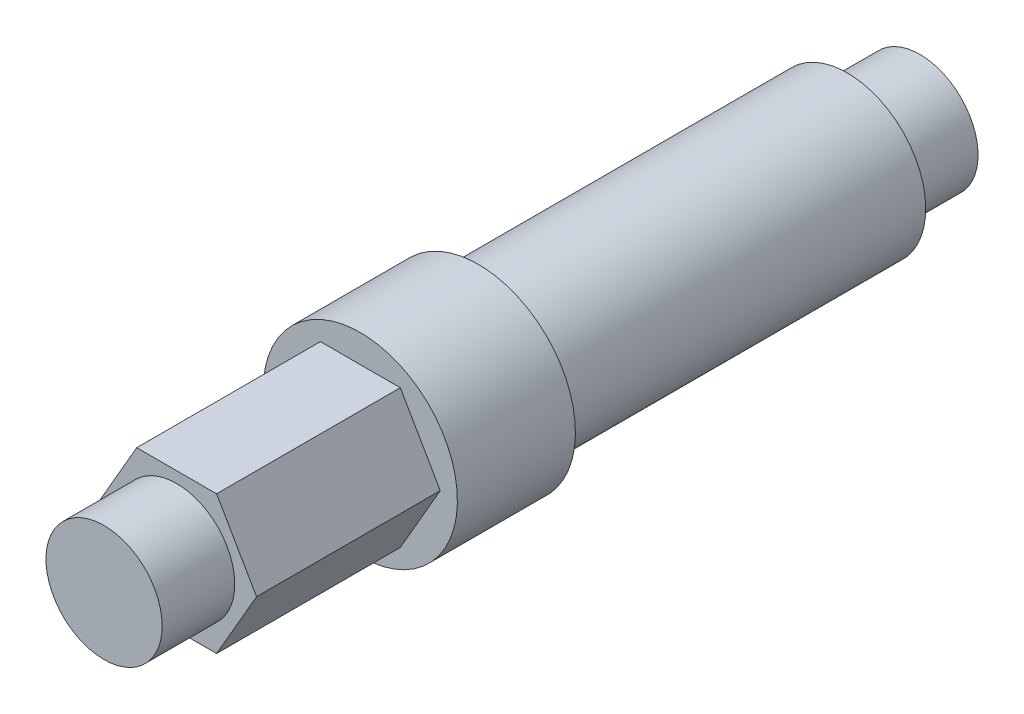
ISO-10303-21;
HEADER;
FILE_DESCRIPTION(('STEP AP214'),'2;1');
FILE_NAME('part.step','',(''),(''),'','','');
FILE_SCHEMA(('AUTOMOTIVE_DESIGN { 1 0 10303 214 1 1 1 1 }'));
ENDSEC;
DATA;
#1=APPLICATION_CONTEXT('core data for automotive mechanical design processes');
#2=APPLICATION_PROTOCOL_DEFINITION('international standard','automotive_design',2000,#1);
#3=PRODUCT_CONTEXT('',#1,'mechanical');
#4=PRODUCT('Part','Part','',(#3));
#5=PRODUCT_RELATED_PRODUCT_CATEGORY('part','',(#4));
#6=PRODUCT_DEFINITION_FORMATION('','',#4);
#7=PRODUCT_DEFINITION_CONTEXT('part definition',#1,'design');
#8=PRODUCT_DEFINITION('design','',#6,#7);
#9=PRODUCT_DEFINITION_SHAPE('','',#8);
#10=(LENGTH_UNIT() NAMED_UNIT(*) SI_UNIT(.MILLI.,.METRE.));
#11=(NAMED_UNIT(*) PLANE_ANGLE_UNIT() SI_UNIT($,.RADIAN.));
#12=(NAMED_UNIT(*) SI_UNIT($,.STERADIAN.) SOLID_ANGLE_UNIT());
#13=UNCERTAINTY_MEASURE_WITH_UNIT(LENGTH_MEASURE(1.E-05),#10,'distance_accuracy_value','');
#14=(GEOMETRIC_REPRESENTATION_CONTEXT(3) GLOBAL_UNCERTAINTY_ASSIGNED_CONTEXT((#13)) GLOBAL_UNIT_ASSIGNED_CONTEXT((#10,
#11,#12)) REPRESENTATION_CONTEXT('',''));
#15=CARTESIAN_POINT('',(0.,0.,0.));
#16=DIRECTION('',(0.,0.,1.));
#17=DIRECTION('',(1.,0.,0.));
#18=AXIS2_PLACEMENT_3D('',#15,#16,#17);
#19=CARTESIAN_POINT('',(-131.668785636611,82.8792010727267,55.9397));
#20=DIRECTION('',(0.,0.,1.));
#21=DIRECTION('',(0.,-1.,0.));
#22=AXIS2_PLACEMENT_3D('',#19,#20,#21);
#23=PLANE('',#22);
#24=CARTESIAN_POINT('',(-127.668785635611,82.8792010727267,55.9397));
#25=DIRECTION('',(0.,0.,1.));
#26=DIRECTION('',(1.,0.,0.));
#27=AXIS2_PLACEMENT_3D('',#24,#25,#26);
#28=CIRCLE('',#27,4.000000001);
#29=CARTESIAN_POINT('',(-123.668785634611,82.8792010727267,55.9397));
#30=VERTEX_POINT('',#29);
#31=EDGE_CURVE('E11',#30,#30,#28,.T.);
#32=ORIENTED_EDGE('',*,*,#31,.T.);
#33=EDGE_LOOP('',(#32));
#34=FACE_BOUND('',#33,.T.);
#35=ADVANCED_FACE('F17',(#34),#23,.T.);
#36=CARTESIAN_POINT('',(-131.668785636611,82.8792010727267,-0.237499811999997));
#37=DIRECTION('',(0.,0.,-1.));
#38=DIRECTION('',(0.,1.,0.));
#39=AXIS2_PLACEMENT_3D('',#36,#37,#38);
#40=PLANE('',#39);
#41=CARTESIAN_POINT('',(-127.668785635611,82.8792010727267,-0.237499811999997));
#42=DIRECTION('',(0.,0.,-1.));
#43=DIRECTION('',(-1.,0.,0.));
#44=AXIS2_PLACEMENT_3D('',#41,#42,#43);
#45=CIRCLE('',#44,4.000000001);
#46=CARTESIAN_POINT('',(-131.668785636611,82.8792010727267,-0.237499811999997));
#47=VERTEX_POINT('',#46);
#48=EDGE_CURVE('E26',#47,#47,#45,.T.);
#49=ORIENTED_EDGE('',*,*,#48,.T.);
#50=EDGE_LOOP('',(#49));
#51=FACE_BOUND('',#50,.T.);
#52=ADVANCED_FACE('F140',(#51),#40,.T.);
#53=CARTESIAN_POINT('',(-134.348985635611,82.8792010727267,50.939700094));
#54=DIRECTION('',(0.,0.,1.));
#55=DIRECTION('',(0.,-1.,0.));
#56=AXIS2_PLACEMENT_3D('',#53,#54,#55);
#57=PLANE('',#56);
#58=DIRECTION('',(0.5,-0.866025403784439,0.));
#59=VECTOR('',#58,1.);
#60=CARTESIAN_POINT('',(-133.094723465455,82.7522010727267,50.939700094));
#61=LINE('',#60,#59);
#62=CARTESIAN_POINT('',(-133.168046949642,82.8792010727267,50.939700094));
#63=VERTEX_POINT('',#62);
#64=CARTESIAN_POINT('',(-130.418416292627,78.1167010727267,50.939700094));
#65=VERTEX_POINT('',#64);
#66=EDGE_CURVE('E195',#63,#65,#61,.T.);
#67=ORIENTED_EDGE('',*,*,#66,.T.);
#68=DIRECTION('',(1.,0.,0.));
#69=VECTOR('',#68,1.);
#70=CARTESIAN_POINT('',(-130.271769324253,78.1167010727267,50.939700094));
#71=LINE('',#70,#69);
#72=CARTESIAN_POINT('',(-124.919154978596,78.1167010727267,50.939700094));
#73=VERTEX_POINT('',#72);
#74=EDGE_CURVE('E98',#65,#73,#71,.T.);
#75=ORIENTED_EDGE('',*,*,#74,.T.);
#76=DIRECTION('',(0.5,0.866025403784439,0.));
#77=VECTOR('',#76,1.);
#78=CARTESIAN_POINT('',(-124.845831494409,78.2437010727267,50.939700094));
#79=LINE('',#78,#77);
#80=CARTESIAN_POINT('',(-122.16952432158,82.8792010727267,50.939700094));
#81=VERTEX_POINT('',#80);
#82=EDGE_CURVE('E33',#73,#81,#79,.T.);
#83=ORIENTED_EDGE('',*,*,#82,.T.);
#84=DIRECTION('',(-0.5,0.866025403784439,0.));
#85=VECTOR('',#84,1.);
#86=CARTESIAN_POINT('',(-122.242847805767,83.0062010727267,50.939700094));
#87=LINE('',#86,#85);
#88=CARTESIAN_POINT('',(-124.919154978596,87.6417010727267,50.939700094));
#89=VERTEX_POINT('',#88);
#90=EDGE_CURVE('E206',#81,#89,#87,.T.);
#91=ORIENTED_EDGE('',*,*,#90,.T.);
#92=DIRECTION('',(-1.,0.,0.));
#93=VECTOR('',#92,1.);
#94=CARTESIAN_POINT('',(-125.06580194697,87.6417010727267,50.939700094));
#95=LINE('',#94,#93);
#96=CARTESIAN_POINT('',(-130.418416292627,87.6417010727267,50.939700094));
#97=VERTEX_POINT('',#96);
#98=EDGE_CURVE('E95',#89,#97,#95,.T.);
#99=ORIENTED_EDGE('',*,*,#98,.T.);
#100=DIRECTION('',(-0.5,-0.866025403784439,0.));
#101=VECTOR('',#100,1.);
#102=CARTESIAN_POINT('',(-130.491739776814,87.5147010727267,50.939700094));
#103=LINE('',#102,#101);
#104=EDGE_CURVE('E200',#97,#63,#103,.T.);
#105=ORIENTED_EDGE('',*,*,#104,.T.);
#106=EDGE_LOOP('',(#67,#75,#83,#91,#99,#105));
#107=FACE_BOUND('',#106,.T.);
#108=CARTESIAN_POINT('',(-127.668785635611,82.8792010727267,50.939700094));
#109=DIRECTION('',(0.,0.,1.));
#110=DIRECTION('',(0.,-1.,0.));
#111=AXIS2_PLACEMENT_3D('',#108,#109,#110);
#112=CIRCLE('',#111,4.000000001);
#113=CARTESIAN_POINT('',(-127.668785635611,78.8792010717267,50.939700094));
#114=VERTEX_POINT('',#113);
#115=EDGE_CURVE('E153',#114,#114,#112,.T.);
#116=ORIENTED_EDGE('',*,*,#115,.F.);
#117=EDGE_LOOP('',(#116));
#118=FACE_BOUND('',#117,.T.);
#119=ADVANCED_FACE('F218',(#107,#118),#57,.T.);
#120=CARTESIAN_POINT('',(-130.271769324253,78.1167010727267,38.290500094));
#121=DIRECTION('',(0.,-1.,0.));
#122=DIRECTION('',(1.,0.,0.));
#123=AXIS2_PLACEMENT_3D('',#120,#121,#122);
#124=PLANE('',#123);
#125=ORIENTED_EDGE('',*,*,#74,.F.);
#126=DIRECTION('',(0.,0.,-1.));
#127=VECTOR('',#126,1.);
#128=CARTESIAN_POINT('',(-130.418416292627,78.1167010727267,38.290500094));
#129=LINE('',#128,#127);
#130=CARTESIAN_POINT('',(-130.418416292627,78.1167010727267,38.290500094));
#131=VERTEX_POINT('',#130);
#132=EDGE_CURVE('E124',#131,#65,#129,.F.);
#133=ORIENTED_EDGE('',*,*,#132,.F.);
#134=DIRECTION('',(1.,0.,0.));
#135=VECTOR('',#134,1.);
#136=CARTESIAN_POINT('',(-130.271769324253,78.1167010727267,38.290500094));
#137=LINE('',#136,#135);
#138=CARTESIAN_POINT('',(-124.919154978596,78.1167010727267,38.290500094));
#139=VERTEX_POINT('',#138);
#140=EDGE_CURVE('E190',#131,#139,#137,.T.);
#141=ORIENTED_EDGE('',*,*,#140,.T.);
#142=DIRECTION('',(0.,0.,-1.));
#143=VECTOR('',#142,1.);
#144=CARTESIAN_POINT('',(-124.919154978596,78.1167010727267,38.290500094));
#145=LINE('',#144,#143);
#146=EDGE_CURVE('E118',#139,#73,#145,.F.);
#147=ORIENTED_EDGE('',*,*,#146,.T.);
#148=EDGE_LOOP('',(#125,#133,#141,#147));
#149=FACE_BOUND('',#148,.T.);
#150=ADVANCED_FACE('F229',(#149),#124,.T.);
#151=CARTESIAN_POINT('',(-124.845831494409,78.2437010727267,38.290500094));
#152=DIRECTION('',(0.866025403784439,-0.5,0.));
#153=DIRECTION('',(0.5,0.866025403784439,0.));
#154=AXIS2_PLACEMENT_3D('',#151,#152,#153);
#155=PLANE('',#154);
#156=ORIENTED_EDGE('',*,*,#82,.F.);
#157=ORIENTED_EDGE('',*,*,#146,.F.);
#158=DIRECTION('',(0.5,0.866025403784439,0.));
#159=VECTOR('',#158,1.);
#160=CARTESIAN_POINT('',(-124.845831494409,78.2437010727267,38.290500094));
#161=LINE('',#160,#159);
#162=CARTESIAN_POINT('',(-122.16952432158,82.8792010727267,38.290500094));
#163=VERTEX_POINT('',#162);
#164=EDGE_CURVE('E41',#139,#163,#161,.T.);
#165=ORIENTED_EDGE('',*,*,#164,.T.);
#166=DIRECTION('',(0.,0.,-1.));
#167=VECTOR('',#166,1.);
#168=CARTESIAN_POINT('',(-122.16952432158,82.8792010727267,38.290500094));
#169=LINE('',#168,#167);
#170=EDGE_CURVE('E78',#163,#81,#169,.F.);
#171=ORIENTED_EDGE('',*,*,#170,.T.);
#172=EDGE_LOOP('',(#156,#157,#165,#171));
#173=FACE_BOUND('',#172,.T.);
#174=ADVANCED_FACE('F230',(#173),#155,.T.);
#175=CARTESIAN_POINT('',(-122.242847805767,83.0062010727267,38.290500094));
#176=DIRECTION('',(0.866025403784439,0.5,0.));
#177=DIRECTION('',(-0.5,0.866025403784439,0.));
#178=AXIS2_PLACEMENT_3D('',#175,#176,#177);
#179=PLANE('',#178);
#180=ORIENTED_EDGE('',*,*,#90,.F.);
#181=ORIENTED_EDGE('',*,*,#170,.F.);
#182=DIRECTION('',(-0.5,0.866025403784439,0.));
#183=VECTOR('',#182,1.);
#184=CARTESIAN_POINT('',(-122.242847805767,83.0062010727267,38.290500094));
#185=LINE('',#184,#183);
#186=CARTESIAN_POINT('',(-124.919154978596,87.6417010727267,38.290500094));
#187=VERTEX_POINT('',#186);
#188=EDGE_CURVE('E73',#163,#187,#185,.T.);
#189=ORIENTED_EDGE('',*,*,#188,.T.);
#190=DIRECTION('',(0.,0.,-1.));
#191=VECTOR('',#190,1.);
#192=CARTESIAN_POINT('',(-124.919154978596,87.6417010727267,38.290500094));
#193=LINE('',#192,#191);
#194=EDGE_CURVE('E77',#187,#89,#193,.F.);
#195=ORIENTED_EDGE('',*,*,#194,.T.);
#196=EDGE_LOOP('',(#180,#181,#189,#195));
#197=FACE_BOUND('',#196,.T.);
#198=ADVANCED_FACE('F75',(#197),#179,.T.);
#199=CARTESIAN_POINT('',(-125.06580194697,87.6417010727267,38.290500094));
#200=DIRECTION('',(0.,1.,0.));
#201=DIRECTION('',(-1.,0.,0.));
#202=AXIS2_PLACEMENT_3D('',#199,#200,#201);
#203=PLANE('',#202);
#204=ORIENTED_EDGE('',*,*,#98,.F.);
#205=ORIENTED_EDGE('',*,*,#194,.F.);
#206=DIRECTION('',(-1.,0.,0.));
#207=VECTOR('',#206,1.);
#208=CARTESIAN_POINT('',(-125.06580194697,87.6417010727267,38.290500094));
#209=LINE('',#208,#207);
#210=CARTESIAN_POINT('',(-130.418416292627,87.6417010727267,38.290500094));
#211=VERTEX_POINT('',#210);
#212=EDGE_CURVE('E81',#187,#211,#209,.T.);
#213=ORIENTED_EDGE('',*,*,#212,.T.);
#214=DIRECTION('',(0.,0.,-1.));
#215=VECTOR('',#214,1.);
#216=CARTESIAN_POINT('',(-130.418416292627,87.6417010727267,38.290500094));
#217=LINE('',#216,#215);
#218=EDGE_CURVE('E97',#211,#97,#217,.F.);
#219=ORIENTED_EDGE('',*,*,#218,.T.);
#220=EDGE_LOOP('',(#204,#205,#213,#219));
#221=FACE_BOUND('',#220,.T.);
#222=ADVANCED_FACE('F94',(#221),#203,.T.);
#223=CARTESIAN_POINT('',(-130.491739776814,87.5147010727267,38.290500094));
#224=DIRECTION('',(-0.866025403784439,0.5,0.));
#225=DIRECTION('',(-0.5,-0.866025403784439,0.));
#226=AXIS2_PLACEMENT_3D('',#223,#224,#225);
#227=PLANE('',#226);
#228=ORIENTED_EDGE('',*,*,#104,.F.);
#229=ORIENTED_EDGE('',*,*,#218,.F.);
#230=DIRECTION('',(-0.5,-0.866025403784439,0.));
#231=VECTOR('',#230,1.);
#232=CARTESIAN_POINT('',(-130.491739776814,87.5147010727267,38.290500094));
#233=LINE('',#232,#231);
#234=CARTESIAN_POINT('',(-133.168046949642,82.8792010727267,38.290500094));
#235=VERTEX_POINT('',#234);
#236=EDGE_CURVE('E87',#211,#235,#233,.T.);
#237=ORIENTED_EDGE('',*,*,#236,.T.);
#238=DIRECTION('',(0.,0.,-1.));
#239=VECTOR('',#238,1.);
#240=CARTESIAN_POINT('',(-133.168046949642,82.8792010727267,38.290500094));
#241=LINE('',#240,#239);
#242=EDGE_CURVE('E104',#235,#63,#241,.F.);
#243=ORIENTED_EDGE('',*,*,#242,.T.);
#244=EDGE_LOOP('',(#228,#229,#237,#243));
#245=FACE_BOUND('',#244,.T.);
#246=ADVANCED_FACE('F226',(#245),#227,.T.);
#247=CARTESIAN_POINT('',(-133.094723465455,82.7522010727267,38.290500094));
#248=DIRECTION('',(-0.866025403784439,-0.5,0.));
#249=DIRECTION('',(0.5,-0.866025403784439,0.));
#250=AXIS2_PLACEMENT_3D('',#247,#248,#249);
#251=PLANE('',#250);
#252=ORIENTED_EDGE('',*,*,#66,.F.);
#253=ORIENTED_EDGE('',*,*,#242,.F.);
#254=DIRECTION('',(0.5,-0.866025403784439,0.));
#255=VECTOR('',#254,1.);
#256=CARTESIAN_POINT('',(-133.094723465455,82.7522010727267,38.290500094));
#257=LINE('',#256,#255);
#258=EDGE_CURVE('E176',#235,#131,#257,.T.);
#259=ORIENTED_EDGE('',*,*,#258,.T.);
#260=ORIENTED_EDGE('',*,*,#132,.T.);
#261=EDGE_LOOP('',(#252,#253,#259,#260));
#262=FACE_BOUND('',#261,.T.);
#263=ADVANCED_FACE('F224',(#262),#251,.T.);
#264=CARTESIAN_POINT('',(-127.668785635611,82.8792010727267,38.290500094));
#265=DIRECTION('',(0.,0.,1.));
#266=DIRECTION('',(0.,-1.,0.));
#267=AXIS2_PLACEMENT_3D('',#264,#265,#266);
#268=PLANE('',#267);
#269=ORIENTED_EDGE('',*,*,#258,.F.);
#270=ORIENTED_EDGE('',*,*,#236,.F.);
#271=ORIENTED_EDGE('',*,*,#212,.F.);
#272=ORIENTED_EDGE('',*,*,#188,.F.);
#273=ORIENTED_EDGE('',*,*,#164,.F.);
#274=ORIENTED_EDGE('',*,*,#140,.F.);
#275=EDGE_LOOP('',(#269,#270,#271,#272,#273,#274));
#276=FACE_BOUND('',#275,.T.);
#277=CARTESIAN_POINT('',(-127.668785635611,82.8792010727267,38.290500094));
#278=DIRECTION('',(0.,0.,-1.));
#279=DIRECTION('',(0.,-1.,0.));
#280=AXIS2_PLACEMENT_3D('',#277,#278,#279);
#281=CIRCLE('',#280,6.6802);
#282=CARTESIAN_POINT('',(-127.668785635611,76.1990010727267,38.290500094));
#283=VERTEX_POINT('',#282);
#284=EDGE_CURVE('E172',#283,#283,#281,.T.);
#285=ORIENTED_EDGE('',*,*,#284,.F.);
#286=EDGE_LOOP('',(#285));
#287=FACE_BOUND('',#286,.T.);
#288=ADVANCED_FACE('F85',(#276,#287),#268,.T.);
#289=CARTESIAN_POINT('',(-133.066285635611,82.8792010727267,30.162500094));
#290=DIRECTION('',(0.,0.,-1.));
#291=DIRECTION('',(0.,1.,0.));
#292=AXIS2_PLACEMENT_3D('',#289,#290,#291);
#293=PLANE('',#292);
#294=CARTESIAN_POINT('',(-127.668785635611,82.8792010727267,30.162500094));
#295=DIRECTION('',(0.,0.,1.));
#296=DIRECTION('',(0.,-1.,0.));
#297=AXIS2_PLACEMENT_3D('',#294,#295,#296);
#298=CIRCLE('',#297,6.6802);
#299=CARTESIAN_POINT('',(-127.668785635611,76.1990010727267,30.162500094));
#300=VERTEX_POINT('',#299);
#301=EDGE_CURVE('E168',#300,#300,#298,.T.);
#302=ORIENTED_EDGE('',*,*,#301,.F.);
#303=EDGE_LOOP('',(#302));
#304=FACE_BOUND('',#303,.T.);
#305=CARTESIAN_POINT('',(-127.668785635611,82.8792010727267,30.162500094));
#306=DIRECTION('',(0.,0.,1.));
#307=DIRECTION('',(0.,-1.,0.));
#308=AXIS2_PLACEMENT_3D('',#305,#306,#307);
#309=CIRCLE('',#308,5.3975);
#310=CARTESIAN_POINT('',(-127.668785635611,77.4817010727267,30.162500094));
#311=VERTEX_POINT('',#310);
#312=EDGE_CURVE('E159',#311,#311,#309,.T.);
#313=ORIENTED_EDGE('',*,*,#312,.T.);
#314=EDGE_LOOP('',(#313));
#315=FACE_BOUND('',#314,.T.);
#316=ADVANCED_FACE('F302',(#304,#315),#293,.T.);
#317=CARTESIAN_POINT('',(-131.668785636611,82.8792010727267,4.76250009400001));
#318=DIRECTION('',(0.,0.,-1.));
#319=DIRECTION('',(0.,1.,0.));
#320=AXIS2_PLACEMENT_3D('',#317,#318,#319);
#321=PLANE('',#320);
#322=CARTESIAN_POINT('',(-127.668785635611,82.8792010727267,4.76250009400001));
#323=DIRECTION('',(0.,0.,1.));
#324=DIRECTION('',(0.,-1.,0.));
#325=AXIS2_PLACEMENT_3D('',#322,#323,#324);
#326=CIRCLE('',#325,5.3975);
#327=CARTESIAN_POINT('',(-127.668785635611,77.4817010727267,4.76250009400001));
#328=VERTEX_POINT('',#327);
#329=EDGE_CURVE('E152',#328,#328,#326,.T.);
#330=ORIENTED_EDGE('',*,*,#329,.F.);
#331=EDGE_LOOP('',(#330));
#332=FACE_BOUND('',#331,.T.);
#333=CARTESIAN_POINT('',(-127.668785635611,82.8792010727267,4.76250009400001));
#334=DIRECTION('',(0.,0.,1.));
#335=DIRECTION('',(0.,-1.,0.));
#336=AXIS2_PLACEMENT_3D('',#333,#334,#335);
#337=CIRCLE('',#336,4.000000001);
#338=CARTESIAN_POINT('',(-127.668785635611,78.8792010717267,4.76250009400001));
#339=VERTEX_POINT('',#338);
#340=EDGE_CURVE('E149',#339,#339,#337,.T.);
#341=ORIENTED_EDGE('',*,*,#340,.T.);
#342=EDGE_LOOP('',(#341));
#343=FACE_BOUND('',#342,.T.);
#344=ADVANCED_FACE('F311',(#332,#343),#321,.T.);
#345=CARTESIAN_POINT('',(-127.668785635611,82.8792010727267,4.76250009400001));
#346=DIRECTION('',(0.,0.,1.));
#347=DIRECTION('',(0.,-1.,0.));
#348=AXIS2_PLACEMENT_3D('',#345,#346,#347);
#349=CYLINDRICAL_SURFACE('',#348,6.6802);
#350=ORIENTED_EDGE('',*,*,#284,.T.);
#351=EDGE_LOOP('',(#350));
#352=FACE_BOUND('',#351,.T.);
#353=ORIENTED_EDGE('',*,*,#301,.T.);
#354=EDGE_LOOP('',(#353));
#355=FACE_BOUND('',#354,.T.);
#356=ADVANCED_FACE('F321',(#352,#355),#349,.T.);
#357=CARTESIAN_POINT('',(-127.668785635611,82.8792010727267,4.76250009400001));
#358=DIRECTION('',(0.,0.,1.));
#359=DIRECTION('',(0.,-1.,0.));
#360=AXIS2_PLACEMENT_3D('',#357,#358,#359);
#361=CYLINDRICAL_SURFACE('',#360,5.3975);
#362=ORIENTED_EDGE('',*,*,#312,.F.);
#363=EDGE_LOOP('',(#362));
#364=FACE_BOUND('',#363,.T.);
#365=ORIENTED_EDGE('',*,*,#329,.T.);
#366=EDGE_LOOP('',(#365));
#367=FACE_BOUND('',#366,.T.);
#368=ADVANCED_FACE('F145',(#364,#367),#361,.T.);
#369=CARTESIAN_POINT('',(-127.668785635611,82.8792010727267,4.76250009400001));
#370=DIRECTION('',(0.,0.,1.));
#371=DIRECTION('',(0.,-1.,0.));
#372=AXIS2_PLACEMENT_3D('',#369,#370,#371);
#373=CYLINDRICAL_SURFACE('',#372,4.000000001);
#374=ORIENTED_EDGE('',*,*,#48,.F.);
#375=EDGE_LOOP('',(#374));
#376=FACE_BOUND('',#375,.T.);
#377=ORIENTED_EDGE('',*,*,#340,.F.);
#378=EDGE_LOOP('',(#377));
#379=FACE_BOUND('',#378,.T.);
#380=ADVANCED_FACE('F142',(#376,#379),#373,.T.);
#381=CARTESIAN_POINT('',(-127.668785635611,82.8792010727267,4.76250009400001));
#382=DIRECTION('',(0.,0.,1.));
#383=DIRECTION('',(0.,-1.,0.));
#384=AXIS2_PLACEMENT_3D('',#381,#382,#383);
#385=CYLINDRICAL_SURFACE('',#384,4.000000001);
#386=ORIENTED_EDGE('',*,*,#31,.F.);
#387=EDGE_LOOP('',(#386));
#388=FACE_BOUND('',#387,.T.);
#389=ORIENTED_EDGE('',*,*,#115,.T.);
#390=EDGE_LOOP('',(#389));
#391=FACE_BOUND('',#390,.T.);
#392=ADVANCED_FACE('F19',(#388,#391),#385,.T.);
#393=CLOSED_SHELL('',(#35,#52,#119,#150,#174,#198,#222,#246,#263,#288,#316,#344,#356,#368,#380,#392));
#394=MANIFOLD_SOLID_BREP('B1',#393);
#395=ADVANCED_BREP_SHAPE_REPRESENTATION('',(#18,#394),#14);
#396=SHAPE_DEFINITION_REPRESENTATION(#9,#395);
ENDSEC;
END-ISO-10303-21;
